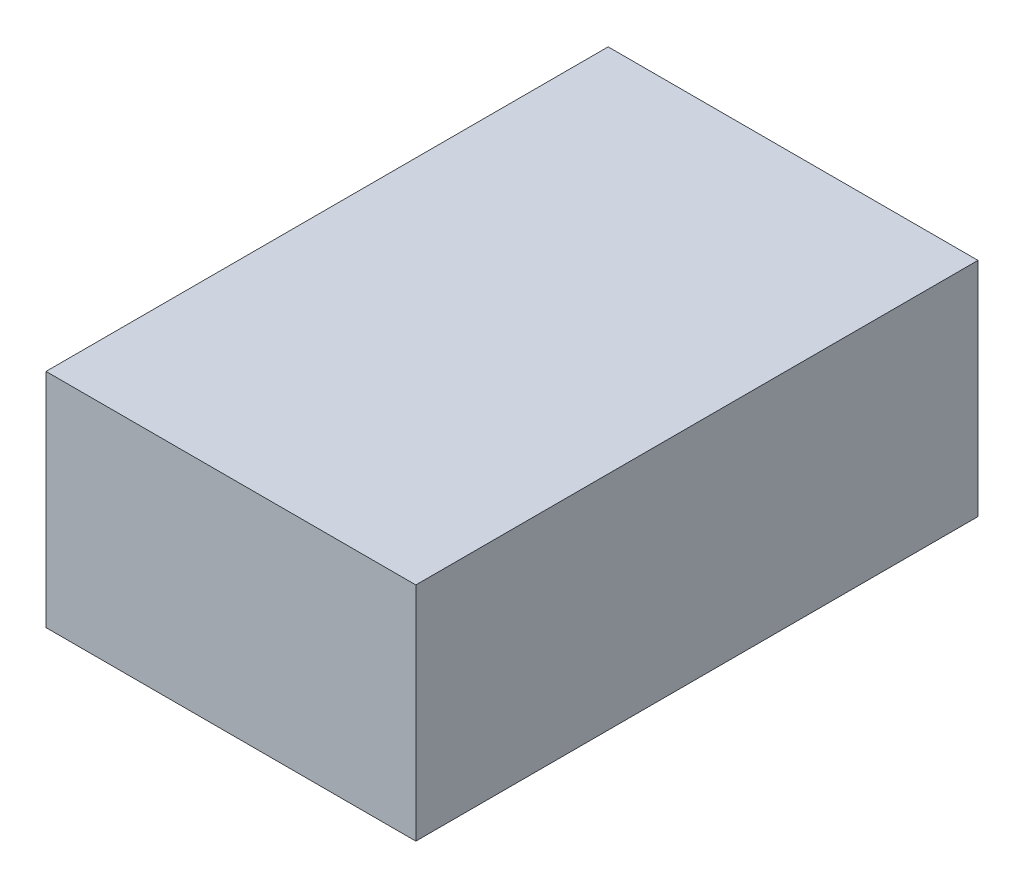
ISO-10303-21;
HEADER;
FILE_DESCRIPTION(('STEP AP214'),'2;1');
FILE_NAME('part.step','',(''),(''),'','','');
FILE_SCHEMA(('AUTOMOTIVE_DESIGN { 1 0 10303 214 1 1 1 1 }'));
ENDSEC;
DATA;
#1=APPLICATION_CONTEXT('core data for automotive mechanical design processes');
#2=APPLICATION_PROTOCOL_DEFINITION('international standard','automotive_design',2000,#1);
#3=PRODUCT_CONTEXT('',#1,'mechanical');
#4=PRODUCT('Part','Part','',(#3));
#5=PRODUCT_RELATED_PRODUCT_CATEGORY('part','',(#4));
#6=PRODUCT_DEFINITION_FORMATION('','',#4);
#7=PRODUCT_DEFINITION_CONTEXT('part definition',#1,'design');
#8=PRODUCT_DEFINITION('design','',#6,#7);
#9=PRODUCT_DEFINITION_SHAPE('','',#8);
#10=(LENGTH_UNIT() NAMED_UNIT(*) SI_UNIT(.MILLI.,.METRE.));
#11=(NAMED_UNIT(*) PLANE_ANGLE_UNIT() SI_UNIT($,.RADIAN.));
#12=(NAMED_UNIT(*) SI_UNIT($,.STERADIAN.) SOLID_ANGLE_UNIT());
#13=UNCERTAINTY_MEASURE_WITH_UNIT(LENGTH_MEASURE(1.E-05),#10,'distance_accuracy_value','');
#14=(GEOMETRIC_REPRESENTATION_CONTEXT(3) GLOBAL_UNCERTAINTY_ASSIGNED_CONTEXT((#13)) GLOBAL_UNIT_ASSIGNED_CONTEXT((#10,
#11,#12)) REPRESENTATION_CONTEXT('',''));
#15=CARTESIAN_POINT('',(0.,0.,0.));
#16=DIRECTION('',(0.,0.,1.));
#17=DIRECTION('',(1.,0.,0.));
#18=AXIS2_PLACEMENT_3D('',#15,#16,#17);
#19=CARTESIAN_POINT('',(0.,38.1,0.));
#20=DIRECTION('',(1.,0.,0.));
#21=DIRECTION('',(0.,0.,-1.));
#22=AXIS2_PLACEMENT_3D('',#19,#20,#21);
#23=PLANE('',#22);
#24=DIRECTION('',(0.,0.,1.));
#25=VECTOR('',#24,1.);
#26=CARTESIAN_POINT('',(0.,0.,0.));
#27=LINE('',#26,#25);
#28=CARTESIAN_POINT('',(0.,0.,-96.52));
#29=VERTEX_POINT('',#28);
#30=CARTESIAN_POINT('',(0.,0.,0.));
#31=VERTEX_POINT('',#30);
#32=EDGE_CURVE('E96',#29,#31,#27,.T.);
#33=ORIENTED_EDGE('',*,*,#32,.T.);
#34=DIRECTION('',(0.,-1.,0.));
#35=VECTOR('',#34,1.);
#36=CARTESIAN_POINT('',(0.,38.1,0.));
#37=LINE('',#36,#35);
#38=CARTESIAN_POINT('',(0.,38.1,0.));
#39=VERTEX_POINT('',#38);
#40=EDGE_CURVE('E11',#39,#31,#37,.T.);
#41=ORIENTED_EDGE('',*,*,#40,.F.);
#42=DIRECTION('',(0.,0.,1.));
#43=VECTOR('',#42,1.);
#44=CARTESIAN_POINT('',(0.,38.1,0.));
#45=LINE('',#44,#43);
#46=CARTESIAN_POINT('',(0.,38.1,-96.52));
#47=VERTEX_POINT('',#46);
#48=EDGE_CURVE('E84',#47,#39,#45,.T.);
#49=ORIENTED_EDGE('',*,*,#48,.F.);
#50=DIRECTION('',(0.,-1.,0.));
#51=VECTOR('',#50,1.);
#52=CARTESIAN_POINT('',(0.,38.1,-96.52));
#53=LINE('',#52,#51);
#54=EDGE_CURVE('E92',#47,#29,#53,.T.);
#55=ORIENTED_EDGE('',*,*,#54,.T.);
#56=EDGE_LOOP('',(#33,#41,#49,#55));
#57=FACE_BOUND('',#56,.T.);
#58=ADVANCED_FACE('F33',(#57),#23,.F.);
#59=CARTESIAN_POINT('',(0.,38.1,0.));
#60=DIRECTION('',(0.,0.,-1.));
#61=DIRECTION('',(-1.,0.,0.));
#62=AXIS2_PLACEMENT_3D('',#59,#60,#61);
#63=PLANE('',#62);
#64=DIRECTION('',(1.,0.,0.));
#65=VECTOR('',#64,1.);
#66=CARTESIAN_POINT('',(0.,0.,0.));
#67=LINE('',#66,#65);
#68=CARTESIAN_POINT('',(63.5,0.,0.));
#69=VERTEX_POINT('',#68);
#70=EDGE_CURVE('E88',#31,#69,#67,.T.);
#71=ORIENTED_EDGE('',*,*,#70,.T.);
#72=DIRECTION('',(0.,-1.,0.));
#73=VECTOR('',#72,1.);
#74=CARTESIAN_POINT('',(63.5,38.1,0.));
#75=LINE('',#74,#73);
#76=CARTESIAN_POINT('',(63.5,38.1,0.));
#77=VERTEX_POINT('',#76);
#78=EDGE_CURVE('E41',#77,#69,#75,.T.);
#79=ORIENTED_EDGE('',*,*,#78,.F.);
#80=DIRECTION('',(1.,0.,0.));
#81=VECTOR('',#80,1.);
#82=CARTESIAN_POINT('',(0.,38.1,0.));
#83=LINE('',#82,#81);
#84=EDGE_CURVE('E79',#39,#77,#83,.T.);
#85=ORIENTED_EDGE('',*,*,#84,.F.);
#86=ORIENTED_EDGE('',*,*,#40,.T.);
#87=EDGE_LOOP('',(#71,#79,#85,#86));
#88=FACE_BOUND('',#87,.T.);
#89=ADVANCED_FACE('F87',(#88),#63,.F.);
#90=CARTESIAN_POINT('',(63.5,38.1,0.));
#91=DIRECTION('',(-1.,0.,0.));
#92=DIRECTION('',(0.,0.,1.));
#93=AXIS2_PLACEMENT_3D('',#90,#91,#92);
#94=PLANE('',#93);
#95=DIRECTION('',(0.,0.,-1.));
#96=VECTOR('',#95,1.);
#97=CARTESIAN_POINT('',(63.5,0.,0.));
#98=LINE('',#97,#96);
#99=CARTESIAN_POINT('',(63.5,0.,-96.52));
#100=VERTEX_POINT('',#99);
#101=EDGE_CURVE('E66',#69,#100,#98,.T.);
#102=ORIENTED_EDGE('',*,*,#101,.T.);
#103=DIRECTION('',(0.,-1.,0.));
#104=VECTOR('',#103,1.);
#105=CARTESIAN_POINT('',(63.5,38.1,-96.52));
#106=LINE('',#105,#104);
#107=CARTESIAN_POINT('',(63.5,38.1,-96.52));
#108=VERTEX_POINT('',#107);
#109=EDGE_CURVE('E89',#108,#100,#106,.T.);
#110=ORIENTED_EDGE('',*,*,#109,.F.);
#111=DIRECTION('',(0.,0.,-1.));
#112=VECTOR('',#111,1.);
#113=CARTESIAN_POINT('',(63.5,38.1,0.));
#114=LINE('',#113,#112);
#115=EDGE_CURVE('E82',#77,#108,#114,.T.);
#116=ORIENTED_EDGE('',*,*,#115,.F.);
#117=ORIENTED_EDGE('',*,*,#78,.T.);
#118=EDGE_LOOP('',(#102,#110,#116,#117));
#119=FACE_BOUND('',#118,.T.);
#120=ADVANCED_FACE('F90',(#119),#94,.F.);
#121=CARTESIAN_POINT('',(0.,38.1,-96.52));
#122=DIRECTION('',(0.,0.,1.));
#123=DIRECTION('',(1.,0.,0.));
#124=AXIS2_PLACEMENT_3D('',#121,#122,#123);
#125=PLANE('',#124);
#126=DIRECTION('',(-1.,0.,0.));
#127=VECTOR('',#126,1.);
#128=CARTESIAN_POINT('',(0.,0.,-96.52));
#129=LINE('',#128,#127);
#130=EDGE_CURVE('E72',#100,#29,#129,.T.);
#131=ORIENTED_EDGE('',*,*,#130,.T.);
#132=ORIENTED_EDGE('',*,*,#54,.F.);
#133=DIRECTION('',(-1.,0.,0.));
#134=VECTOR('',#133,1.);
#135=CARTESIAN_POINT('',(0.,38.1,-96.52));
#136=LINE('',#135,#134);
#137=EDGE_CURVE('E49',#108,#47,#136,.T.);
#138=ORIENTED_EDGE('',*,*,#137,.F.);
#139=ORIENTED_EDGE('',*,*,#109,.T.);
#140=EDGE_LOOP('',(#131,#132,#138,#139));
#141=FACE_BOUND('',#140,.T.);
#142=ADVANCED_FACE('F103',(#141),#125,.F.);
#143=CARTESIAN_POINT('',(0.,38.1,0.));
#144=DIRECTION('',(0.,-1.,0.));
#145=DIRECTION('',(0.,0.,-1.));
#146=AXIS2_PLACEMENT_3D('',#143,#144,#145);
#147=PLANE('',#146);
#148=ORIENTED_EDGE('',*,*,#48,.T.);
#149=ORIENTED_EDGE('',*,*,#84,.T.);
#150=ORIENTED_EDGE('',*,*,#115,.T.);
#151=ORIENTED_EDGE('',*,*,#137,.T.);
#152=EDGE_LOOP('',(#148,#149,#150,#151));
#153=FACE_BOUND('',#152,.T.);
#154=ADVANCED_FACE('F80',(#153),#147,.F.);
#155=CARTESIAN_POINT('',(0.,0.,0.));
#156=DIRECTION('',(0.,-1.,0.));
#157=DIRECTION('',(0.,0.,-1.));
#158=AXIS2_PLACEMENT_3D('',#155,#156,#157);
#159=PLANE('',#158);
#160=ORIENTED_EDGE('',*,*,#32,.F.);
#161=ORIENTED_EDGE('',*,*,#130,.F.);
#162=ORIENTED_EDGE('',*,*,#101,.F.);
#163=ORIENTED_EDGE('',*,*,#70,.F.);
#164=EDGE_LOOP('',(#160,#161,#162,#163));
#165=FACE_BOUND('',#164,.T.);
#166=ADVANCED_FACE('F106',(#165),#159,.T.);
#167=CLOSED_SHELL('',(#58,#89,#120,#142,#154,#166));
#168=MANIFOLD_SOLID_BREP('B2',#167);
#169=ADVANCED_BREP_SHAPE_REPRESENTATION('',(#18,#168),#14);
#170=SHAPE_DEFINITION_REPRESENTATION(#9,#169);
ENDSEC;
END-ISO-10303-21;
